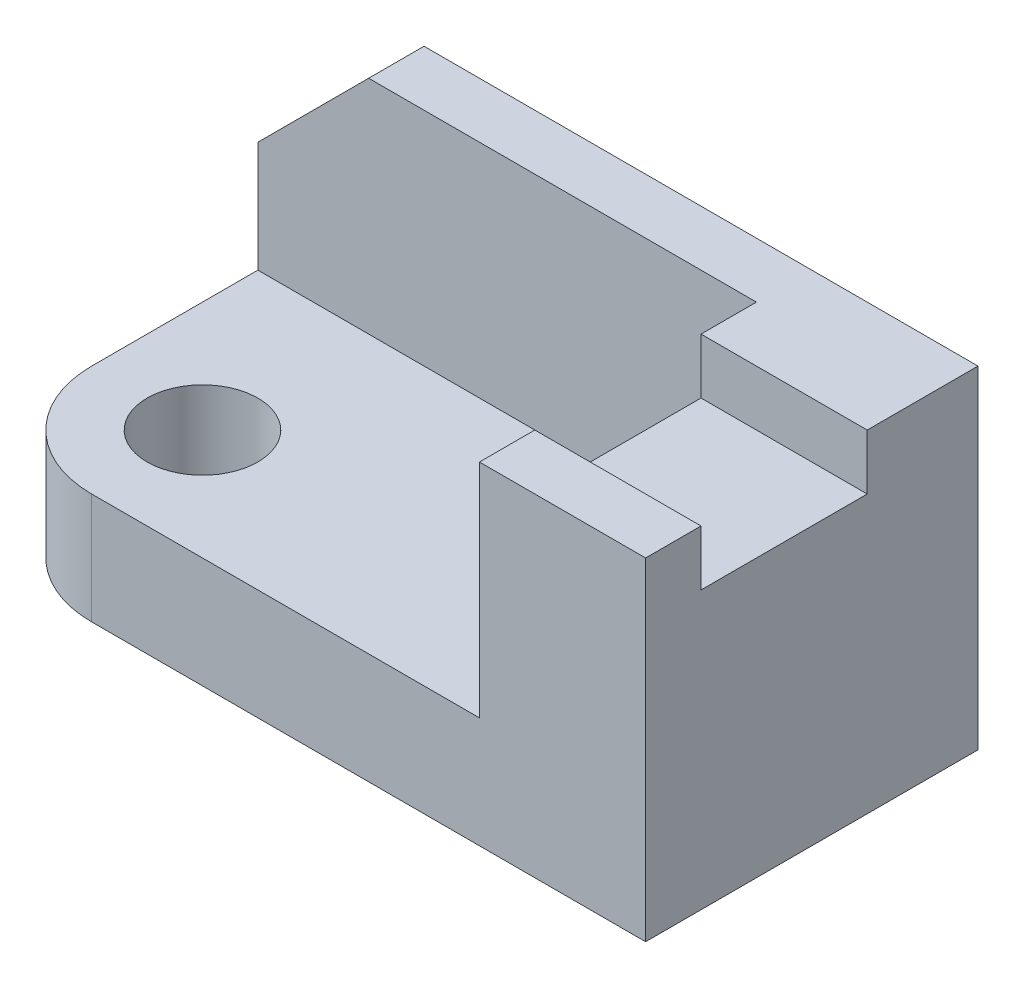
ISO-10303-21;
HEADER;
FILE_DESCRIPTION(('STEP AP214'),'2;1');
FILE_NAME('part.step','',(''),(''),'','','');
FILE_SCHEMA(('AUTOMOTIVE_DESIGN { 1 0 10303 214 1 1 1 1 }'));
ENDSEC;
DATA;
#1=APPLICATION_CONTEXT('core data for automotive mechanical design processes');
#2=APPLICATION_PROTOCOL_DEFINITION('international standard','automotive_design',2000,#1);
#3=PRODUCT_CONTEXT('',#1,'mechanical');
#4=PRODUCT('Part','Part','',(#3));
#5=PRODUCT_RELATED_PRODUCT_CATEGORY('part','',(#4));
#6=PRODUCT_DEFINITION_FORMATION('','',#4);
#7=PRODUCT_DEFINITION_CONTEXT('part definition',#1,'design');
#8=PRODUCT_DEFINITION('design','',#6,#7);
#9=PRODUCT_DEFINITION_SHAPE('','',#8);
#10=(LENGTH_UNIT() NAMED_UNIT(*) SI_UNIT(.MILLI.,.METRE.));
#11=(NAMED_UNIT(*) PLANE_ANGLE_UNIT() SI_UNIT($,.RADIAN.));
#12=(NAMED_UNIT(*) SI_UNIT($,.STERADIAN.) SOLID_ANGLE_UNIT());
#13=UNCERTAINTY_MEASURE_WITH_UNIT(LENGTH_MEASURE(1.E-05),#10,'distance_accuracy_value','');
#14=(GEOMETRIC_REPRESENTATION_CONTEXT(3) GLOBAL_UNCERTAINTY_ASSIGNED_CONTEXT((#13)) GLOBAL_UNIT_ASSIGNED_CONTEXT((#10,
#11,#12)) REPRESENTATION_CONTEXT('',''));
#15=CARTESIAN_POINT('',(0.,0.,0.));
#16=DIRECTION('',(0.,0.,1.));
#17=DIRECTION('',(1.,0.,0.));
#18=AXIS2_PLACEMENT_3D('',#15,#16,#17);
#19=CARTESIAN_POINT('',(0.,60.,0.));
#20=DIRECTION('',(0.,-1.,0.));
#21=DIRECTION('',(0.,0.,-1.));
#22=AXIS2_PLACEMENT_3D('',#19,#20,#21);
#23=PLANE('',#22);
#24=DIRECTION('',(1.,0.,0.));
#25=VECTOR('',#24,1.);
#26=CARTESIAN_POINT('',(-30.,60.,-40.));
#27=LINE('',#26,#25);
#28=CARTESIAN_POINT('',(-30.,60.,-40.));
#29=VERTEX_POINT('',#28);
#30=CARTESIAN_POINT('',(0.,60.,-40.));
#31=VERTEX_POINT('',#30);
#32=EDGE_CURVE('E150',#29,#31,#27,.T.);
#33=ORIENTED_EDGE('',*,*,#32,.T.);
#34=DIRECTION('',(0.,0.,1.));
#35=VECTOR('',#34,1.);
#36=CARTESIAN_POINT('',(0.,60.,-60.));
#37=LINE('',#36,#35);
#38=CARTESIAN_POINT('',(0.,60.,-60.));
#39=VERTEX_POINT('',#38);
#40=EDGE_CURVE('E170',#39,#31,#37,.T.);
#41=ORIENTED_EDGE('',*,*,#40,.F.);
#42=DIRECTION('',(1.,0.,0.));
#43=VECTOR('',#42,1.);
#44=CARTESIAN_POINT('',(-120.,60.,-60.));
#45=LINE('',#44,#43);
#46=CARTESIAN_POINT('',(-100.,60.,-60.));
#47=VERTEX_POINT('',#46);
#48=EDGE_CURVE('E182',#47,#39,#45,.T.);
#49=ORIENTED_EDGE('',*,*,#48,.F.);
#50=DIRECTION('',(0.,0.,1.));
#51=VECTOR('',#50,1.);
#52=CARTESIAN_POINT('',(-100.,60.,0.));
#53=LINE('',#52,#51);
#54=CARTESIAN_POINT('',(-100.,60.,-50.));
#55=VERTEX_POINT('',#54);
#56=EDGE_CURVE('E230',#47,#55,#53,.T.);
#57=ORIENTED_EDGE('',*,*,#56,.T.);
#58=DIRECTION('',(1.,0.,0.));
#59=VECTOR('',#58,1.);
#60=CARTESIAN_POINT('',(-120.,60.,-50.));
#61=LINE('',#60,#59);
#62=CARTESIAN_POINT('',(-30.,60.,-50.));
#63=VERTEX_POINT('',#62);
#64=EDGE_CURVE('E180',#55,#63,#61,.T.);
#65=ORIENTED_EDGE('',*,*,#64,.T.);
#66=DIRECTION('',(0.,0.,1.));
#67=VECTOR('',#66,1.);
#68=CARTESIAN_POINT('',(-30.,60.,-50.));
#69=LINE('',#68,#67);
#70=EDGE_CURVE('E177',#63,#29,#69,.T.);
#71=ORIENTED_EDGE('',*,*,#70,.T.);
#72=EDGE_LOOP('',(#33,#41,#49,#57,#65,#71));
#73=FACE_BOUND('',#72,.T.);
#74=ADVANCED_FACE('F37',(#73),#23,.F.);
#75=CARTESIAN_POINT('',(0.,20.,0.));
#76=DIRECTION('',(-1.,0.,0.));
#77=DIRECTION('',(0.,0.,1.));
#78=AXIS2_PLACEMENT_3D('',#75,#76,#77);
#79=PLANE('',#78);
#80=DIRECTION('',(0.,0.,1.));
#81=VECTOR('',#80,1.);
#82=CARTESIAN_POINT('',(0.,50.,-40.));
#83=LINE('',#82,#81);
#84=CARTESIAN_POINT('',(0.,50.,-40.));
#85=VERTEX_POINT('',#84);
#86=CARTESIAN_POINT('',(0.,50.,-10.));
#87=VERTEX_POINT('',#86);
#88=EDGE_CURVE('E147',#85,#87,#83,.T.);
#89=ORIENTED_EDGE('',*,*,#88,.T.);
#90=DIRECTION('',(0.,1.,0.));
#91=VECTOR('',#90,1.);
#92=CARTESIAN_POINT('',(0.,50.,-10.));
#93=LINE('',#92,#91);
#94=CARTESIAN_POINT('',(0.,60.,-10.));
#95=VERTEX_POINT('',#94);
#96=EDGE_CURVE('E131',#87,#95,#93,.T.);
#97=ORIENTED_EDGE('',*,*,#96,.T.);
#98=CARTESIAN_POINT('',(0.,60.,0.));
#99=VERTEX_POINT('',#98);
#100=EDGE_CURVE('E173',#95,#99,#37,.T.);
#101=ORIENTED_EDGE('',*,*,#100,.T.);
#102=DIRECTION('',(0.,-1.,0.));
#103=VECTOR('',#102,1.);
#104=CARTESIAN_POINT('',(0.,20.,0.));
#105=LINE('',#104,#103);
#106=CARTESIAN_POINT('',(0.,0.,0.));
#107=VERTEX_POINT('',#106);
#108=EDGE_CURVE('E204',#99,#107,#105,.T.);
#109=ORIENTED_EDGE('',*,*,#108,.T.);
#110=DIRECTION('',(0.,0.,-1.));
#111=VECTOR('',#110,1.);
#112=CARTESIAN_POINT('',(0.,0.,0.));
#113=LINE('',#112,#111);
#114=CARTESIAN_POINT('',(0.,0.,-60.));
#115=VERTEX_POINT('',#114);
#116=EDGE_CURVE('E192',#107,#115,#113,.T.);
#117=ORIENTED_EDGE('',*,*,#116,.T.);
#118=DIRECTION('',(0.,-1.,0.));
#119=VECTOR('',#118,1.);
#120=CARTESIAN_POINT('',(0.,20.,-60.));
#121=LINE('',#120,#119);
#122=EDGE_CURVE('E218',#39,#115,#121,.T.);
#123=ORIENTED_EDGE('',*,*,#122,.F.);
#124=ORIENTED_EDGE('',*,*,#40,.T.);
#125=DIRECTION('',(0.,1.,0.));
#126=VECTOR('',#125,1.);
#127=CARTESIAN_POINT('',(0.,50.,-40.));
#128=LINE('',#127,#126);
#129=EDGE_CURVE('E53',#85,#31,#128,.T.);
#130=ORIENTED_EDGE('',*,*,#129,.F.);
#131=EDGE_LOOP('',(#89,#97,#101,#109,#117,#123,#124,#130));
#132=FACE_BOUND('',#131,.T.);
#133=ADVANCED_FACE('F152',(#132),#79,.F.);
#134=CARTESIAN_POINT('',(0.,20.,-60.));
#135=DIRECTION('',(0.,0.,1.));
#136=DIRECTION('',(1.,0.,0.));
#137=AXIS2_PLACEMENT_3D('',#134,#135,#136);
#138=PLANE('',#137);
#139=DIRECTION('',(0.,-1.,0.));
#140=VECTOR('',#139,1.);
#141=CARTESIAN_POINT('',(-120.,20.,-60.));
#142=LINE('',#141,#140);
#143=CARTESIAN_POINT('',(-120.,39.9999999999999,-60.));
#144=VERTEX_POINT('',#143);
#145=CARTESIAN_POINT('',(-120.,0.,-60.));
#146=VERTEX_POINT('',#145);
#147=EDGE_CURVE('E216',#144,#146,#142,.T.);
#148=ORIENTED_EDGE('',*,*,#147,.F.);
#149=DIRECTION('',(-0.707106781186546,-0.707106781186549,0.));
#150=VECTOR('',#149,1.);
#151=CARTESIAN_POINT('',(-100.,60.,-60.));
#152=LINE('',#151,#150);
#153=EDGE_CURVE('E11',#144,#47,#152,.F.);
#154=ORIENTED_EDGE('',*,*,#153,.T.);
#155=ORIENTED_EDGE('',*,*,#48,.T.);
#156=ORIENTED_EDGE('',*,*,#122,.T.);
#157=DIRECTION('',(-1.,0.,0.));
#158=VECTOR('',#157,1.);
#159=CARTESIAN_POINT('',(0.,0.,-60.));
#160=LINE('',#159,#158);
#161=EDGE_CURVE('E207',#115,#146,#160,.T.);
#162=ORIENTED_EDGE('',*,*,#161,.T.);
#163=EDGE_LOOP('',(#148,#154,#155,#156,#162));
#164=FACE_BOUND('',#163,.T.);
#165=ADVANCED_FACE('F246',(#164),#138,.F.);
#166=CARTESIAN_POINT('',(-120.,20.,0.));
#167=DIRECTION('',(1.,0.,0.));
#168=DIRECTION('',(0.,0.,-1.));
#169=AXIS2_PLACEMENT_3D('',#166,#167,#168);
#170=PLANE('',#169);
#171=DIRECTION('',(0.,-1.,0.));
#172=VECTOR('',#171,1.);
#173=CARTESIAN_POINT('',(-120.,60.,-50.));
#174=LINE('',#173,#172);
#175=CARTESIAN_POINT('',(-120.,39.9999999999999,-50.));
#176=VERTEX_POINT('',#175);
#177=CARTESIAN_POINT('',(-120.,20.,-50.));
#178=VERTEX_POINT('',#177);
#179=EDGE_CURVE('E190',#176,#178,#174,.T.);
#180=ORIENTED_EDGE('',*,*,#179,.F.);
#181=DIRECTION('',(0.,0.,-1.));
#182=VECTOR('',#181,1.);
#183=CARTESIAN_POINT('',(-120.,39.9999999999999,0.));
#184=LINE('',#183,#182);
#185=EDGE_CURVE('E46',#176,#144,#184,.T.);
#186=ORIENTED_EDGE('',*,*,#185,.T.);
#187=ORIENTED_EDGE('',*,*,#147,.T.);
#188=DIRECTION('',(0.,0.,1.));
#189=VECTOR('',#188,1.);
#190=CARTESIAN_POINT('',(-120.,0.,0.));
#191=LINE('',#190,#189);
#192=CARTESIAN_POINT('',(-120.,0.,-20.));
#193=VERTEX_POINT('',#192);
#194=EDGE_CURVE('E210',#146,#193,#191,.T.);
#195=ORIENTED_EDGE('',*,*,#194,.T.);
#196=DIRECTION('',(0.,-1.,0.));
#197=VECTOR('',#196,1.);
#198=CARTESIAN_POINT('',(-120.,20.,-20.));
#199=LINE('',#198,#197);
#200=CARTESIAN_POINT('',(-120.,20.,-20.));
#201=VERTEX_POINT('',#200);
#202=EDGE_CURVE('E226',#193,#201,#199,.F.);
#203=ORIENTED_EDGE('',*,*,#202,.T.);
#204=DIRECTION('',(0.,0.,1.));
#205=VECTOR('',#204,1.);
#206=CARTESIAN_POINT('',(-120.,20.,0.));
#207=LINE('',#206,#205);
#208=EDGE_CURVE('E198',#178,#201,#207,.T.);
#209=ORIENTED_EDGE('',*,*,#208,.F.);
#210=EDGE_LOOP('',(#180,#186,#187,#195,#203,#209));
#211=FACE_BOUND('',#210,.T.);
#212=ADVANCED_FACE('F242',(#211),#170,.F.);
#213=CARTESIAN_POINT('',(0.,20.,0.));
#214=DIRECTION('',(0.,0.,-1.));
#215=DIRECTION('',(-1.,0.,0.));
#216=AXIS2_PLACEMENT_3D('',#213,#214,#215);
#217=PLANE('',#216);
#218=DIRECTION('',(1.,0.,0.));
#219=VECTOR('',#218,1.);
#220=CARTESIAN_POINT('',(0.,20.,0.));
#221=LINE('',#220,#219);
#222=CARTESIAN_POINT('',(-100.,20.,0.));
#223=VERTEX_POINT('',#222);
#224=CARTESIAN_POINT('',(-30.,20.,0.));
#225=VERTEX_POINT('',#224);
#226=EDGE_CURVE('E201',#223,#225,#221,.T.);
#227=ORIENTED_EDGE('',*,*,#226,.F.);
#228=DIRECTION('',(0.,-1.,0.));
#229=VECTOR('',#228,1.);
#230=CARTESIAN_POINT('',(-100.,20.,0.));
#231=LINE('',#230,#229);
#232=CARTESIAN_POINT('',(-100.,0.,0.));
#233=VERTEX_POINT('',#232);
#234=EDGE_CURVE('E221',#223,#233,#231,.T.);
#235=ORIENTED_EDGE('',*,*,#234,.T.);
#236=DIRECTION('',(1.,0.,0.));
#237=VECTOR('',#236,1.);
#238=CARTESIAN_POINT('',(0.,0.,0.));
#239=LINE('',#238,#237);
#240=EDGE_CURVE('E202',#233,#107,#239,.T.);
#241=ORIENTED_EDGE('',*,*,#240,.T.);
#242=ORIENTED_EDGE('',*,*,#108,.F.);
#243=DIRECTION('',(-1.,0.,0.));
#244=VECTOR('',#243,1.);
#245=CARTESIAN_POINT('',(0.,60.,0.));
#246=LINE('',#245,#244);
#247=CARTESIAN_POINT('',(-30.,60.,0.));
#248=VERTEX_POINT('',#247);
#249=EDGE_CURVE('E172',#99,#248,#246,.T.);
#250=ORIENTED_EDGE('',*,*,#249,.T.);
#251=DIRECTION('',(0.,-1.,0.));
#252=VECTOR('',#251,1.);
#253=CARTESIAN_POINT('',(-30.,60.,0.));
#254=LINE('',#253,#252);
#255=EDGE_CURVE('E184',#248,#225,#254,.T.);
#256=ORIENTED_EDGE('',*,*,#255,.T.);
#257=EDGE_LOOP('',(#227,#235,#241,#242,#250,#256));
#258=FACE_BOUND('',#257,.T.);
#259=ADVANCED_FACE('F264',(#258),#217,.F.);
#260=CARTESIAN_POINT('',(0.,20.,0.));
#261=DIRECTION('',(0.,1.,0.));
#262=DIRECTION('',(0.,0.,1.));
#263=AXIS2_PLACEMENT_3D('',#260,#261,#262);
#264=PLANE('',#263);
#265=CARTESIAN_POINT('',(-100.,20.,-20.));
#266=DIRECTION('',(0.,1.,0.));
#267=DIRECTION('',(0.,0.,1.));
#268=AXIS2_PLACEMENT_3D('',#265,#266,#267);
#269=CIRCLE('',#268,9.99999999999999);
#270=CARTESIAN_POINT('',(-100.,20.,-10.));
#271=VERTEX_POINT('',#270);
#272=EDGE_CURVE('E456',#271,#271,#269,.T.);
#273=ORIENTED_EDGE('',*,*,#272,.F.);
#274=EDGE_LOOP('',(#273));
#275=FACE_BOUND('',#274,.T.);
#276=ORIENTED_EDGE('',*,*,#208,.T.);
#277=CARTESIAN_POINT('',(-100.,20.,-20.));
#278=DIRECTION('',(0.,1.,0.));
#279=DIRECTION('',(0.,0.,1.));
#280=AXIS2_PLACEMENT_3D('',#277,#278,#279);
#281=CIRCLE('',#280,20.);
#282=EDGE_CURVE('E228',#201,#223,#281,.T.);
#283=ORIENTED_EDGE('',*,*,#282,.T.);
#284=ORIENTED_EDGE('',*,*,#226,.T.);
#285=DIRECTION('',(0.,0.,1.));
#286=VECTOR('',#285,1.);
#287=CARTESIAN_POINT('',(-30.,20.,-50.));
#288=LINE('',#287,#286);
#289=CARTESIAN_POINT('',(-30.,20.,-50.));
#290=VERTEX_POINT('',#289);
#291=EDGE_CURVE('E165',#290,#225,#288,.T.);
#292=ORIENTED_EDGE('',*,*,#291,.F.);
#293=DIRECTION('',(1.,0.,0.));
#294=VECTOR('',#293,1.);
#295=CARTESIAN_POINT('',(-120.,20.,-50.));
#296=LINE('',#295,#294);
#297=EDGE_CURVE('E187',#178,#290,#296,.T.);
#298=ORIENTED_EDGE('',*,*,#297,.F.);
#299=EDGE_LOOP('',(#276,#283,#284,#292,#298));
#300=FACE_BOUND('',#299,.T.);
#301=ADVANCED_FACE('F262',(#275,#300),#264,.T.);
#302=CARTESIAN_POINT('',(0.,0.,0.));
#303=DIRECTION('',(0.,1.,0.));
#304=DIRECTION('',(0.,0.,1.));
#305=AXIS2_PLACEMENT_3D('',#302,#303,#304);
#306=PLANE('',#305);
#307=CARTESIAN_POINT('',(-100.,0.,-20.));
#308=DIRECTION('',(0.,1.,0.));
#309=DIRECTION('',(0.,0.,1.));
#310=AXIS2_PLACEMENT_3D('',#307,#308,#309);
#311=CIRCLE('',#310,9.99999999999999);
#312=CARTESIAN_POINT('',(-100.,0.,-10.));
#313=VERTEX_POINT('',#312);
#314=EDGE_CURVE('E161',#313,#313,#311,.T.);
#315=ORIENTED_EDGE('',*,*,#314,.T.);
#316=EDGE_LOOP('',(#315));
#317=FACE_BOUND('',#316,.T.);
#318=ORIENTED_EDGE('',*,*,#240,.F.);
#319=CARTESIAN_POINT('',(-100.,0.,-20.));
#320=DIRECTION('',(0.,1.,0.));
#321=DIRECTION('',(0.,0.,1.));
#322=AXIS2_PLACEMENT_3D('',#319,#320,#321);
#323=CIRCLE('',#322,20.);
#324=EDGE_CURVE('E224',#233,#193,#323,.F.);
#325=ORIENTED_EDGE('',*,*,#324,.T.);
#326=ORIENTED_EDGE('',*,*,#194,.F.);
#327=ORIENTED_EDGE('',*,*,#161,.F.);
#328=ORIENTED_EDGE('',*,*,#116,.F.);
#329=EDGE_LOOP('',(#318,#325,#326,#327,#328));
#330=FACE_BOUND('',#329,.T.);
#331=ADVANCED_FACE('F254',(#317,#330),#306,.F.);
#332=CARTESIAN_POINT('',(-120.,60.,-50.));
#333=DIRECTION('',(0.,0.,-1.));
#334=DIRECTION('',(-1.,0.,0.));
#335=AXIS2_PLACEMENT_3D('',#332,#333,#334);
#336=PLANE('',#335);
#337=ORIENTED_EDGE('',*,*,#64,.F.);
#338=DIRECTION('',(0.707106781186546,0.707106781186549,0.));
#339=VECTOR('',#338,1.);
#340=CARTESIAN_POINT('',(-100.,60.,-50.));
#341=LINE('',#340,#339);
#342=EDGE_CURVE('E233',#55,#176,#341,.F.);
#343=ORIENTED_EDGE('',*,*,#342,.T.);
#344=ORIENTED_EDGE('',*,*,#179,.T.);
#345=ORIENTED_EDGE('',*,*,#297,.T.);
#346=DIRECTION('',(0.,-1.,0.));
#347=VECTOR('',#346,1.);
#348=CARTESIAN_POINT('',(-30.,60.,-50.));
#349=LINE('',#348,#347);
#350=EDGE_CURVE('E193',#63,#290,#349,.T.);
#351=ORIENTED_EDGE('',*,*,#350,.F.);
#352=EDGE_LOOP('',(#337,#343,#344,#345,#351));
#353=FACE_BOUND('',#352,.T.);
#354=ADVANCED_FACE('F236',(#353),#336,.F.);
#355=CARTESIAN_POINT('',(-30.,60.,-50.));
#356=DIRECTION('',(1.,0.,0.));
#357=DIRECTION('',(0.,0.,-1.));
#358=AXIS2_PLACEMENT_3D('',#355,#356,#357);
#359=PLANE('',#358);
#360=CARTESIAN_POINT('',(-30.,60.,-10.));
#361=VERTEX_POINT('',#360);
#362=EDGE_CURVE('E176',#361,#248,#69,.T.);
#363=ORIENTED_EDGE('',*,*,#362,.F.);
#364=DIRECTION('',(0.,1.,0.));
#365=VECTOR('',#364,1.);
#366=CARTESIAN_POINT('',(-30.,50.,-10.));
#367=LINE('',#366,#365);
#368=CARTESIAN_POINT('',(-30.,50.,-10.));
#369=VERTEX_POINT('',#368);
#370=EDGE_CURVE('E163',#369,#361,#367,.T.);
#371=ORIENTED_EDGE('',*,*,#370,.F.);
#372=DIRECTION('',(0.,0.,1.));
#373=VECTOR('',#372,1.);
#374=CARTESIAN_POINT('',(-30.,50.,-40.));
#375=LINE('',#374,#373);
#376=CARTESIAN_POINT('',(-30.,50.,-40.));
#377=VERTEX_POINT('',#376);
#378=EDGE_CURVE('E141',#377,#369,#375,.T.);
#379=ORIENTED_EDGE('',*,*,#378,.F.);
#380=DIRECTION('',(0.,1.,0.));
#381=VECTOR('',#380,1.);
#382=CARTESIAN_POINT('',(-30.,50.,-40.));
#383=LINE('',#382,#381);
#384=EDGE_CURVE('E166',#377,#29,#383,.T.);
#385=ORIENTED_EDGE('',*,*,#384,.T.);
#386=ORIENTED_EDGE('',*,*,#70,.F.);
#387=ORIENTED_EDGE('',*,*,#350,.T.);
#388=ORIENTED_EDGE('',*,*,#291,.T.);
#389=ORIENTED_EDGE('',*,*,#255,.F.);
#390=EDGE_LOOP('',(#363,#371,#379,#385,#386,#387,#388,#389));
#391=FACE_BOUND('',#390,.T.);
#392=ADVANCED_FACE('F270',(#391),#359,.F.);
#393=ORIENTED_EDGE('',*,*,#100,.F.);
#394=DIRECTION('',(1.,0.,0.));
#395=VECTOR('',#394,1.);
#396=CARTESIAN_POINT('',(-30.,60.,-10.));
#397=LINE('',#396,#395);
#398=EDGE_CURVE('E137',#361,#95,#397,.T.);
#399=ORIENTED_EDGE('',*,*,#398,.F.);
#400=ORIENTED_EDGE('',*,*,#362,.T.);
#401=ORIENTED_EDGE('',*,*,#249,.F.);
#402=EDGE_LOOP('',(#393,#399,#400,#401));
#403=FACE_BOUND('',#402,.T.);
#404=ADVANCED_FACE('F284',(#403),#23,.F.);
#405=CARTESIAN_POINT('',(-100.,20.,-20.));
#406=DIRECTION('',(0.,-1.,0.));
#407=DIRECTION('',(0.,0.,-1.));
#408=AXIS2_PLACEMENT_3D('',#405,#406,#407);
#409=CYLINDRICAL_SURFACE('',#408,20.);
#410=ORIENTED_EDGE('',*,*,#282,.F.);
#411=ORIENTED_EDGE('',*,*,#202,.F.);
#412=ORIENTED_EDGE('',*,*,#324,.F.);
#413=ORIENTED_EDGE('',*,*,#234,.F.);
#414=EDGE_LOOP('',(#410,#411,#412,#413));
#415=FACE_BOUND('',#414,.T.);
#416=ADVANCED_FACE('F258',(#415),#409,.T.);
#417=CARTESIAN_POINT('',(-100.,60.,0.));
#418=DIRECTION('',(0.707106781186549,-0.707106781186546,0.));
#419=DIRECTION('',(0.,0.,1.));
#420=AXIS2_PLACEMENT_3D('',#417,#418,#419);
#421=PLANE('',#420);
#422=ORIENTED_EDGE('',*,*,#153,.F.);
#423=ORIENTED_EDGE('',*,*,#185,.F.);
#424=ORIENTED_EDGE('',*,*,#342,.F.);
#425=ORIENTED_EDGE('',*,*,#56,.F.);
#426=EDGE_LOOP('',(#422,#423,#424,#425));
#427=FACE_BOUND('',#426,.T.);
#428=ADVANCED_FACE('F40',(#427),#421,.F.);
#429=CARTESIAN_POINT('',(-30.,50.,-10.));
#430=DIRECTION('',(0.,0.,1.));
#431=DIRECTION('',(1.,0.,0.));
#432=AXIS2_PLACEMENT_3D('',#429,#430,#431);
#433=PLANE('',#432);
#434=ORIENTED_EDGE('',*,*,#398,.T.);
#435=ORIENTED_EDGE('',*,*,#96,.F.);
#436=DIRECTION('',(1.,0.,0.));
#437=VECTOR('',#436,1.);
#438=CARTESIAN_POINT('',(-30.,50.,-10.));
#439=LINE('',#438,#437);
#440=EDGE_CURVE('E134',#369,#87,#439,.T.);
#441=ORIENTED_EDGE('',*,*,#440,.F.);
#442=ORIENTED_EDGE('',*,*,#370,.T.);
#443=EDGE_LOOP('',(#434,#435,#441,#442));
#444=FACE_BOUND('',#443,.T.);
#445=ADVANCED_FACE('F133',(#444),#433,.F.);
#446=CARTESIAN_POINT('',(-30.,50.,-40.));
#447=DIRECTION('',(0.,0.,1.));
#448=DIRECTION('',(1.,0.,0.));
#449=AXIS2_PLACEMENT_3D('',#446,#447,#448);
#450=PLANE('',#449);
#451=ORIENTED_EDGE('',*,*,#32,.F.);
#452=ORIENTED_EDGE('',*,*,#384,.F.);
#453=DIRECTION('',(1.,0.,0.));
#454=VECTOR('',#453,1.);
#455=CARTESIAN_POINT('',(-30.,50.,-40.));
#456=LINE('',#455,#454);
#457=EDGE_CURVE('E154',#377,#85,#456,.T.);
#458=ORIENTED_EDGE('',*,*,#457,.T.);
#459=ORIENTED_EDGE('',*,*,#129,.T.);
#460=EDGE_LOOP('',(#451,#452,#458,#459));
#461=FACE_BOUND('',#460,.T.);
#462=ADVANCED_FACE('F272',(#461),#450,.T.);
#463=CARTESIAN_POINT('',(0.,50.,0.));
#464=DIRECTION('',(0.,-1.,0.));
#465=DIRECTION('',(0.,0.,-1.));
#466=AXIS2_PLACEMENT_3D('',#463,#464,#465);
#467=PLANE('',#466);
#468=ORIENTED_EDGE('',*,*,#440,.T.);
#469=ORIENTED_EDGE('',*,*,#88,.F.);
#470=ORIENTED_EDGE('',*,*,#457,.F.);
#471=ORIENTED_EDGE('',*,*,#378,.T.);
#472=EDGE_LOOP('',(#468,#469,#470,#471));
#473=FACE_BOUND('',#472,.T.);
#474=ADVANCED_FACE('F145',(#473),#467,.F.);
#475=CARTESIAN_POINT('',(-100.,0.,-20.));
#476=DIRECTION('',(0.,1.,0.));
#477=DIRECTION('',(0.,0.,1.));
#478=AXIS2_PLACEMENT_3D('',#475,#476,#477);
#479=CYLINDRICAL_SURFACE('',#478,9.99999999999999);
#480=ORIENTED_EDGE('',*,*,#314,.F.);
#481=EDGE_LOOP('',(#480));
#482=FACE_BOUND('',#481,.T.);
#483=ORIENTED_EDGE('',*,*,#272,.T.);
#484=EDGE_LOOP('',(#483));
#485=FACE_BOUND('',#484,.T.);
#486=ADVANCED_FACE('F279',(#482,#485),#479,.F.);
#487=CLOSED_SHELL('',(#74,#133,#165,#212,#259,#301,#331,#354,#392,#404,#416,#428,#445,#462,#474,#486));
#488=MANIFOLD_SOLID_BREP('B2',#487);
#489=ADVANCED_BREP_SHAPE_REPRESENTATION('',(#18,#488),#14);
#490=SHAPE_DEFINITION_REPRESENTATION(#9,#489);
ENDSEC;
END-ISO-10303-21;
